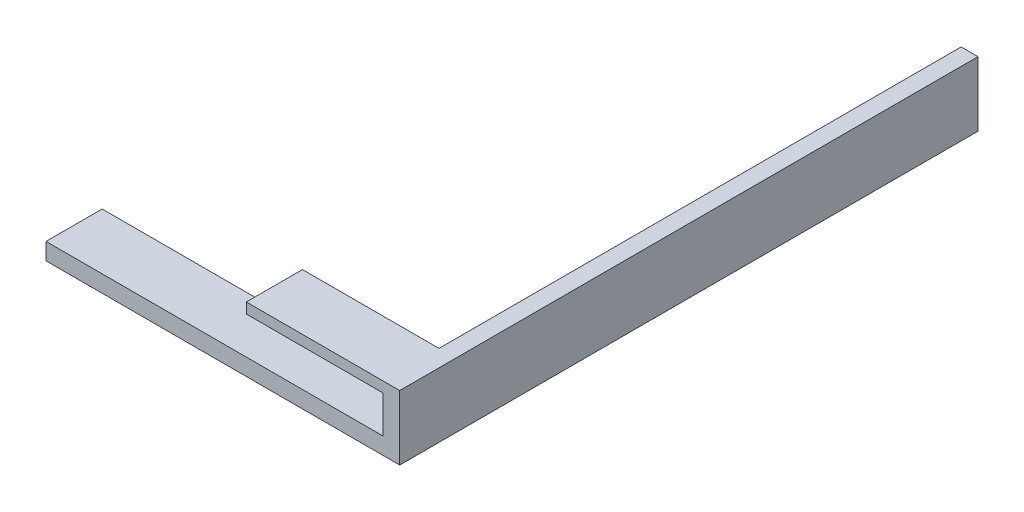
ISO-10303-21;
HEADER;
FILE_DESCRIPTION(('STEP AP214'),'2;1');
FILE_NAME('part.step','',(''),(''),'','','');
FILE_SCHEMA(('AUTOMOTIVE_DESIGN { 1 0 10303 214 1 1 1 1 }'));
ENDSEC;
DATA;
#1=APPLICATION_CONTEXT('core data for automotive mechanical design processes');
#2=APPLICATION_PROTOCOL_DEFINITION('international standard','automotive_design',2000,#1);
#3=PRODUCT_CONTEXT('',#1,'mechanical');
#4=PRODUCT('Part','Part','',(#3));
#5=PRODUCT_RELATED_PRODUCT_CATEGORY('part','',(#4));
#6=PRODUCT_DEFINITION_FORMATION('','',#4);
#7=PRODUCT_DEFINITION_CONTEXT('part definition',#1,'design');
#8=PRODUCT_DEFINITION('design','',#6,#7);
#9=PRODUCT_DEFINITION_SHAPE('','',#8);
#10=(LENGTH_UNIT() NAMED_UNIT(*) SI_UNIT(.MILLI.,.METRE.));
#11=(NAMED_UNIT(*) PLANE_ANGLE_UNIT() SI_UNIT($,.RADIAN.));
#12=(NAMED_UNIT(*) SI_UNIT($,.STERADIAN.) SOLID_ANGLE_UNIT());
#13=UNCERTAINTY_MEASURE_WITH_UNIT(LENGTH_MEASURE(1.E-05),#10,'distance_accuracy_value','');
#14=(GEOMETRIC_REPRESENTATION_CONTEXT(3) GLOBAL_UNCERTAINTY_ASSIGNED_CONTEXT((#13)) GLOBAL_UNIT_ASSIGNED_CONTEXT((#10,
#11,#12)) REPRESENTATION_CONTEXT('',''));
#15=CARTESIAN_POINT('',(0.,0.,0.));
#16=DIRECTION('',(0.,0.,1.));
#17=DIRECTION('',(1.,0.,0.));
#18=AXIS2_PLACEMENT_3D('',#15,#16,#17);
#19=CARTESIAN_POINT('',(8.18,11.5,-4.99999999999999));
#20=DIRECTION('',(0.,0.,1.));
#21=DIRECTION('',(1.,0.,0.));
#22=AXIS2_PLACEMENT_3D('',#19,#20,#21);
#23=PLANE('',#22);
#24=DIRECTION('',(1.,0.,0.));
#25=VECTOR('',#24,1.);
#26=CARTESIAN_POINT('',(4.18,9.63871681183734,-4.99999999999999));
#27=LINE('',#26,#25);
#28=CARTESIAN_POINT('',(4.18,9.63871681183734,-4.99999999999999));
#29=VERTEX_POINT('',#28);
#30=CARTESIAN_POINT('',(28.5,9.63871681183734,-4.99999999999999));
#31=VERTEX_POINT('',#30);
#32=EDGE_CURVE('E132',#29,#31,#27,.T.);
#33=ORIENTED_EDGE('',*,*,#32,.F.);
#34=DIRECTION('',(0.,-1.,0.));
#35=VECTOR('',#34,1.);
#36=CARTESIAN_POINT('',(4.18,11.5,-4.99999999999999));
#37=LINE('',#36,#35);
#38=CARTESIAN_POINT('',(4.18,11.5,-4.99999999999999));
#39=VERTEX_POINT('',#38);
#40=EDGE_CURVE('E144',#39,#29,#37,.T.);
#41=ORIENTED_EDGE('',*,*,#40,.F.);
#42=DIRECTION('',(1.,0.,0.));
#43=VECTOR('',#42,1.);
#44=CARTESIAN_POINT('',(8.18,11.5,-4.99999999999999));
#45=LINE('',#44,#43);
#46=CARTESIAN_POINT('',(28.5,11.5,-4.99999999999999));
#47=VERTEX_POINT('',#46);
#48=EDGE_CURVE('E142',#39,#47,#45,.T.);
#49=ORIENTED_EDGE('',*,*,#48,.T.);
#50=DIRECTION('',(0.,-1.,0.));
#51=VECTOR('',#50,1.);
#52=CARTESIAN_POINT('',(28.5,11.5,-4.99999999999999));
#53=LINE('',#52,#51);
#54=EDGE_CURVE('E127',#47,#31,#53,.T.);
#55=ORIENTED_EDGE('',*,*,#54,.T.);
#56=EDGE_LOOP('',(#33,#41,#49,#55));
#57=FACE_BOUND('',#56,.T.);
#58=ADVANCED_FACE('F44',(#57),#23,.F.);
#59=CARTESIAN_POINT('',(4.18,0.,0.));
#60=DIRECTION('',(-1.,0.,0.));
#61=DIRECTION('',(0.,0.,1.));
#62=AXIS2_PLACEMENT_3D('',#59,#60,#61);
#63=PLANE('',#62);
#64=ORIENTED_EDGE('',*,*,#40,.T.);
#65=DIRECTION('',(0.,0.,-1.));
#66=VECTOR('',#65,1.);
#67=CARTESIAN_POINT('',(4.18,9.63871681183734,5.));
#68=LINE('',#67,#66);
#69=CARTESIAN_POINT('',(4.18,9.63871681183734,5.));
#70=VERTEX_POINT('',#69);
#71=EDGE_CURVE('E136',#70,#29,#68,.T.);
#72=ORIENTED_EDGE('',*,*,#71,.F.);
#73=DIRECTION('',(0.,1.,0.));
#74=VECTOR('',#73,1.);
#75=CARTESIAN_POINT('',(4.18,7.63871681183734,5.));
#76=LINE('',#75,#74);
#77=CARTESIAN_POINT('',(4.18,11.5,5.));
#78=VERTEX_POINT('',#77);
#79=EDGE_CURVE('E239',#70,#78,#76,.T.);
#80=ORIENTED_EDGE('',*,*,#79,.T.);
#81=DIRECTION('',(0.,0.,-1.));
#82=VECTOR('',#81,1.);
#83=CARTESIAN_POINT('',(4.18,11.5,5.));
#84=LINE('',#83,#82);
#85=EDGE_CURVE('E150',#78,#39,#84,.T.);
#86=ORIENTED_EDGE('',*,*,#85,.T.);
#87=EDGE_LOOP('',(#64,#72,#80,#86));
#88=FACE_BOUND('',#87,.T.);
#89=ADVANCED_FACE('F246',(#88),#63,.T.);
#90=CARTESIAN_POINT('',(28.5,0.,0.));
#91=DIRECTION('',(-1.,0.,0.));
#92=DIRECTION('',(0.,0.,1.));
#93=AXIS2_PLACEMENT_3D('',#90,#91,#92);
#94=PLANE('',#93);
#95=DIRECTION('',(0.,1.,0.));
#96=VECTOR('',#95,1.);
#97=CARTESIAN_POINT('',(28.5,3.00000000000003,5.));
#98=LINE('',#97,#96);
#99=CARTESIAN_POINT('',(28.5,3.00000000000003,5.));
#100=VERTEX_POINT('',#99);
#101=CARTESIAN_POINT('',(28.5,9.63871681183734,5.));
#102=VERTEX_POINT('',#101);
#103=EDGE_CURVE('E130',#100,#102,#98,.T.);
#104=ORIENTED_EDGE('',*,*,#103,.T.);
#105=DIRECTION('',(0.,0.,1.));
#106=VECTOR('',#105,1.);
#107=CARTESIAN_POINT('',(28.5,9.63871681183734,-4.99999999999999));
#108=LINE('',#107,#106);
#109=EDGE_CURVE('E122',#31,#102,#108,.T.);
#110=ORIENTED_EDGE('',*,*,#109,.F.);
#111=ORIENTED_EDGE('',*,*,#54,.F.);
#112=DIRECTION('',(0.,0.,1.));
#113=VECTOR('',#112,1.);
#114=CARTESIAN_POINT('',(28.5,11.5,-98.));
#115=LINE('',#114,#113);
#116=CARTESIAN_POINT('',(28.5,11.5,-98.));
#117=VERTEX_POINT('',#116);
#118=EDGE_CURVE('E157',#117,#47,#115,.T.);
#119=ORIENTED_EDGE('',*,*,#118,.F.);
#120=DIRECTION('',(0.,1.,0.));
#121=VECTOR('',#120,1.);
#122=CARTESIAN_POINT('',(28.5,0.,-98.));
#123=LINE('',#122,#121);
#124=CARTESIAN_POINT('',(28.5,0.,-98.));
#125=VERTEX_POINT('',#124);
#126=EDGE_CURVE('E175',#125,#117,#123,.T.);
#127=ORIENTED_EDGE('',*,*,#126,.F.);
#128=DIRECTION('',(0.,0.,1.));
#129=VECTOR('',#128,1.);
#130=CARTESIAN_POINT('',(28.5,0.,-98.));
#131=LINE('',#130,#129);
#132=CARTESIAN_POINT('',(28.5,0.,-5.));
#133=VERTEX_POINT('',#132);
#134=EDGE_CURVE('E178',#125,#133,#131,.T.);
#135=ORIENTED_EDGE('',*,*,#134,.T.);
#136=DIRECTION('',(0.,1.,0.));
#137=VECTOR('',#136,1.);
#138=CARTESIAN_POINT('',(28.5,0.,-5.));
#139=LINE('',#138,#137);
#140=CARTESIAN_POINT('',(28.5,3.,-5.));
#141=VERTEX_POINT('',#140);
#142=EDGE_CURVE('E68',#133,#141,#139,.T.);
#143=ORIENTED_EDGE('',*,*,#142,.T.);
#144=DIRECTION('',(0.,0.,1.));
#145=VECTOR('',#144,1.);
#146=CARTESIAN_POINT('',(28.5,3.,-5.));
#147=LINE('',#146,#145);
#148=EDGE_CURVE('E183',#141,#100,#147,.T.);
#149=ORIENTED_EDGE('',*,*,#148,.T.);
#150=EDGE_LOOP('',(#104,#110,#111,#119,#127,#135,#143,#149));
#151=FACE_BOUND('',#150,.T.);
#152=ADVANCED_FACE('F124',(#151),#94,.T.);
#153=CARTESIAN_POINT('',(-31.5,2.,-5.));
#154=DIRECTION('',(0.,0.,1.));
#155=DIRECTION('',(1.,0.,0.));
#156=AXIS2_PLACEMENT_3D('',#153,#154,#155);
#157=PLANE('',#156);
#158=ORIENTED_EDGE('',*,*,#142,.F.);
#159=DIRECTION('',(-1.,0.,0.));
#160=VECTOR('',#159,1.);
#161=CARTESIAN_POINT('',(-31.5,0.,-5.));
#162=LINE('',#161,#160);
#163=CARTESIAN_POINT('',(-31.5,0.,-5.));
#164=VERTEX_POINT('',#163);
#165=EDGE_CURVE('E201',#133,#164,#162,.T.);
#166=ORIENTED_EDGE('',*,*,#165,.T.);
#167=DIRECTION('',(0.,-1.,0.));
#168=VECTOR('',#167,1.);
#169=CARTESIAN_POINT('',(-31.5,2.,-5.));
#170=LINE('',#169,#168);
#171=CARTESIAN_POINT('',(-31.5,3.,-5.));
#172=VERTEX_POINT('',#171);
#173=EDGE_CURVE('E11',#172,#164,#170,.T.);
#174=ORIENTED_EDGE('',*,*,#173,.F.);
#175=DIRECTION('',(-1.,0.,0.));
#176=VECTOR('',#175,1.);
#177=CARTESIAN_POINT('',(29.5,3.,-5.));
#178=LINE('',#177,#176);
#179=EDGE_CURVE('E191',#141,#172,#178,.T.);
#180=ORIENTED_EDGE('',*,*,#179,.F.);
#181=EDGE_LOOP('',(#158,#166,#174,#180));
#182=FACE_BOUND('',#181,.T.);
#183=ADVANCED_FACE('F253',(#182),#157,.F.);
#184=CARTESIAN_POINT('',(31.5,2.,5.));
#185=DIRECTION('',(-1.,0.,0.));
#186=DIRECTION('',(0.,0.,1.));
#187=AXIS2_PLACEMENT_3D('',#184,#185,#186);
#188=PLANE('',#187);
#189=DIRECTION('',(0.,-1.,0.));
#190=VECTOR('',#189,1.);
#191=CARTESIAN_POINT('',(31.5,0.,-98.));
#192=LINE('',#191,#190);
#193=CARTESIAN_POINT('',(31.5,11.5,-98.));
#194=VERTEX_POINT('',#193);
#195=CARTESIAN_POINT('',(31.5,0.,-98.));
#196=VERTEX_POINT('',#195);
#197=EDGE_CURVE('E168',#194,#196,#192,.T.);
#198=ORIENTED_EDGE('',*,*,#197,.F.);
#199=DIRECTION('',(0.,0.,-1.));
#200=VECTOR('',#199,1.);
#201=CARTESIAN_POINT('',(31.5,11.5,5.));
#202=LINE('',#201,#200);
#203=CARTESIAN_POINT('',(31.5,11.5,5.));
#204=VERTEX_POINT('',#203);
#205=EDGE_CURVE('E164',#204,#194,#202,.T.);
#206=ORIENTED_EDGE('',*,*,#205,.F.);
#207=DIRECTION('',(0.,-1.,0.));
#208=VECTOR('',#207,1.);
#209=CARTESIAN_POINT('',(31.5,2.,5.));
#210=LINE('',#209,#208);
#211=CARTESIAN_POINT('',(31.5,0.,5.));
#212=VERTEX_POINT('',#211);
#213=EDGE_CURVE('E211',#204,#212,#210,.T.);
#214=ORIENTED_EDGE('',*,*,#213,.T.);
#215=DIRECTION('',(0.,0.,-1.));
#216=VECTOR('',#215,1.);
#217=CARTESIAN_POINT('',(31.5,0.,5.));
#218=LINE('',#217,#216);
#219=EDGE_CURVE('E198',#212,#196,#218,.T.);
#220=ORIENTED_EDGE('',*,*,#219,.T.);
#221=EDGE_LOOP('',(#198,#206,#214,#220));
#222=FACE_BOUND('',#221,.T.);
#223=ADVANCED_FACE('F46',(#222),#188,.F.);
#224=CARTESIAN_POINT('',(-31.5,2.,5.));
#225=DIRECTION('',(1.,0.,0.));
#226=DIRECTION('',(0.,0.,-1.));
#227=AXIS2_PLACEMENT_3D('',#224,#225,#226);
#228=PLANE('',#227);
#229=DIRECTION('',(0.,0.,1.));
#230=VECTOR('',#229,1.);
#231=CARTESIAN_POINT('',(-31.5,0.,5.));
#232=LINE('',#231,#230);
#233=CARTESIAN_POINT('',(-31.5,0.,5.));
#234=VERTEX_POINT('',#233);
#235=EDGE_CURVE('E204',#164,#234,#232,.T.);
#236=ORIENTED_EDGE('',*,*,#235,.T.);
#237=DIRECTION('',(0.,-1.,0.));
#238=VECTOR('',#237,1.);
#239=CARTESIAN_POINT('',(-31.5,2.,5.));
#240=LINE('',#239,#238);
#241=CARTESIAN_POINT('',(-31.5,3.,5.));
#242=VERTEX_POINT('',#241);
#243=EDGE_CURVE('E53',#242,#234,#240,.T.);
#244=ORIENTED_EDGE('',*,*,#243,.F.);
#245=DIRECTION('',(0.,0.,1.));
#246=VECTOR('',#245,1.);
#247=CARTESIAN_POINT('',(-31.5,3.,-5.));
#248=LINE('',#247,#246);
#249=EDGE_CURVE('E194',#172,#242,#248,.T.);
#250=ORIENTED_EDGE('',*,*,#249,.F.);
#251=ORIENTED_EDGE('',*,*,#173,.T.);
#252=EDGE_LOOP('',(#236,#244,#250,#251));
#253=FACE_BOUND('',#252,.T.);
#254=ADVANCED_FACE('F272',(#253),#228,.F.);
#255=CARTESIAN_POINT('',(-31.5,2.,5.));
#256=DIRECTION('',(0.,0.,-1.));
#257=DIRECTION('',(-1.,0.,0.));
#258=AXIS2_PLACEMENT_3D('',#255,#256,#257);
#259=PLANE('',#258);
#260=DIRECTION('',(-1.,0.,0.));
#261=VECTOR('',#260,1.);
#262=CARTESIAN_POINT('',(28.5,9.63871681183734,5.));
#263=LINE('',#262,#261);
#264=EDGE_CURVE('E60',#102,#70,#263,.T.);
#265=ORIENTED_EDGE('',*,*,#264,.F.);
#266=ORIENTED_EDGE('',*,*,#103,.F.);
#267=DIRECTION('',(1.,0.,0.));
#268=VECTOR('',#267,1.);
#269=CARTESIAN_POINT('',(-31.5,3.,5.));
#270=LINE('',#269,#268);
#271=EDGE_CURVE('E188',#242,#100,#270,.T.);
#272=ORIENTED_EDGE('',*,*,#271,.F.);
#273=ORIENTED_EDGE('',*,*,#243,.T.);
#274=DIRECTION('',(1.,0.,0.));
#275=VECTOR('',#274,1.);
#276=CARTESIAN_POINT('',(-31.5,0.,5.));
#277=LINE('',#276,#275);
#278=EDGE_CURVE('E207',#234,#212,#277,.T.);
#279=ORIENTED_EDGE('',*,*,#278,.T.);
#280=ORIENTED_EDGE('',*,*,#213,.F.);
#281=DIRECTION('',(1.,0.,0.));
#282=VECTOR('',#281,1.);
#283=CARTESIAN_POINT('',(28.5,11.5,5.));
#284=LINE('',#283,#282);
#285=EDGE_CURVE('E160',#78,#204,#284,.T.);
#286=ORIENTED_EDGE('',*,*,#285,.F.);
#287=ORIENTED_EDGE('',*,*,#79,.F.);
#288=EDGE_LOOP('',(#265,#266,#272,#273,#279,#280,#286,#287));
#289=FACE_BOUND('',#288,.T.);
#290=ADVANCED_FACE('F218',(#289),#259,.F.);
#291=CARTESIAN_POINT('',(0.,0.,0.));
#292=DIRECTION('',(0.,-1.,0.));
#293=DIRECTION('',(0.,0.,-1.));
#294=AXIS2_PLACEMENT_3D('',#291,#292,#293);
#295=PLANE('',#294);
#296=ORIENTED_EDGE('',*,*,#219,.F.);
#297=ORIENTED_EDGE('',*,*,#278,.F.);
#298=ORIENTED_EDGE('',*,*,#235,.F.);
#299=ORIENTED_EDGE('',*,*,#165,.F.);
#300=ORIENTED_EDGE('',*,*,#134,.F.);
#301=DIRECTION('',(-1.,0.,0.));
#302=VECTOR('',#301,1.);
#303=CARTESIAN_POINT('',(31.5,0.,-98.));
#304=LINE('',#303,#302);
#305=EDGE_CURVE('E172',#196,#125,#304,.T.);
#306=ORIENTED_EDGE('',*,*,#305,.F.);
#307=EDGE_LOOP('',(#296,#297,#298,#299,#300,#306));
#308=FACE_BOUND('',#307,.T.);
#309=ADVANCED_FACE('F224',(#308),#295,.T.);
#310=CARTESIAN_POINT('',(0.,3.,0.));
#311=DIRECTION('',(0.,1.,0.));
#312=DIRECTION('',(0.,0.,1.));
#313=AXIS2_PLACEMENT_3D('',#310,#311,#312);
#314=PLANE('',#313);
#315=ORIENTED_EDGE('',*,*,#148,.F.);
#316=ORIENTED_EDGE('',*,*,#179,.T.);
#317=ORIENTED_EDGE('',*,*,#249,.T.);
#318=ORIENTED_EDGE('',*,*,#271,.T.);
#319=EDGE_LOOP('',(#315,#316,#317,#318));
#320=FACE_BOUND('',#319,.T.);
#321=ADVANCED_FACE('F262',(#320),#314,.T.);
#322=CARTESIAN_POINT('',(0.,0.,-98.));
#323=DIRECTION('',(0.,0.,1.));
#324=DIRECTION('',(1.,0.,0.));
#325=AXIS2_PLACEMENT_3D('',#322,#323,#324);
#326=PLANE('',#325);
#327=ORIENTED_EDGE('',*,*,#197,.T.);
#328=ORIENTED_EDGE('',*,*,#305,.T.);
#329=ORIENTED_EDGE('',*,*,#126,.T.);
#330=DIRECTION('',(-1.,0.,0.));
#331=VECTOR('',#330,1.);
#332=CARTESIAN_POINT('',(31.5,11.5,-98.));
#333=LINE('',#332,#331);
#334=EDGE_CURVE('E148',#194,#117,#333,.T.);
#335=ORIENTED_EDGE('',*,*,#334,.F.);
#336=EDGE_LOOP('',(#327,#328,#329,#335));
#337=FACE_BOUND('',#336,.T.);
#338=ADVANCED_FACE('F260',(#337),#326,.F.);
#339=CARTESIAN_POINT('',(0.,11.4999999999999,0.));
#340=DIRECTION('',(0.,1.,0.));
#341=DIRECTION('',(-1.,0.,0.));
#342=AXIS2_PLACEMENT_3D('',#339,#340,#341);
#343=PLANE('',#342);
#344=ORIENTED_EDGE('',*,*,#334,.T.);
#345=ORIENTED_EDGE('',*,*,#118,.T.);
#346=ORIENTED_EDGE('',*,*,#48,.F.);
#347=ORIENTED_EDGE('',*,*,#85,.F.);
#348=ORIENTED_EDGE('',*,*,#285,.T.);
#349=ORIENTED_EDGE('',*,*,#205,.T.);
#350=EDGE_LOOP('',(#344,#345,#346,#347,#348,#349));
#351=FACE_BOUND('',#350,.T.);
#352=ADVANCED_FACE('F234',(#351),#343,.T.);
#353=CARTESIAN_POINT('',(0.,9.63871681183734,0.));
#354=DIRECTION('',(0.,-1.,0.));
#355=DIRECTION('',(0.,0.,-1.));
#356=AXIS2_PLACEMENT_3D('',#353,#354,#355);
#357=PLANE('',#356);
#358=ORIENTED_EDGE('',*,*,#32,.T.);
#359=ORIENTED_EDGE('',*,*,#109,.T.);
#360=ORIENTED_EDGE('',*,*,#264,.T.);
#361=ORIENTED_EDGE('',*,*,#71,.T.);
#362=EDGE_LOOP('',(#358,#359,#360,#361));
#363=FACE_BOUND('',#362,.T.);
#364=ADVANCED_FACE('F135',(#363),#357,.T.);
#365=CLOSED_SHELL('',(#58,#89,#152,#183,#223,#254,#290,#309,#321,#338,#352,#364));
#366=MANIFOLD_SOLID_BREP('B2',#365);
#367=ADVANCED_BREP_SHAPE_REPRESENTATION('',(#18,#366),#14);
#368=SHAPE_DEFINITION_REPRESENTATION(#9,#367);
ENDSEC;
END-ISO-10303-21;
